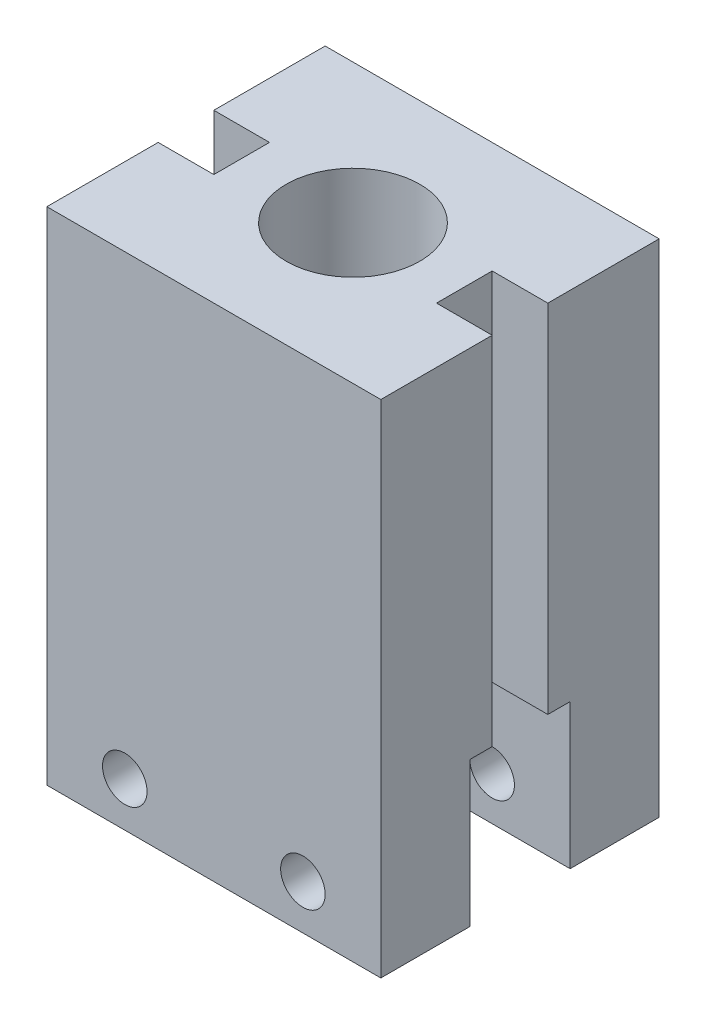
ISO-10303-21;
HEADER;
FILE_DESCRIPTION(('STEP AP214'),'2;1');
FILE_NAME('part.step','',(''),(''),'','','');
FILE_SCHEMA(('AUTOMOTIVE_DESIGN { 1 0 10303 214 1 1 1 1 }'));
ENDSEC;
DATA;
#1=APPLICATION_CONTEXT('core data for automotive mechanical design processes');
#2=APPLICATION_PROTOCOL_DEFINITION('international standard','automotive_design',2000,#1);
#3=PRODUCT_CONTEXT('',#1,'mechanical');
#4=PRODUCT('Part','Part','',(#3));
#5=PRODUCT_RELATED_PRODUCT_CATEGORY('part','',(#4));
#6=PRODUCT_DEFINITION_FORMATION('','',#4);
#7=PRODUCT_DEFINITION_CONTEXT('part definition',#1,'design');
#8=PRODUCT_DEFINITION('design','',#6,#7);
#9=PRODUCT_DEFINITION_SHAPE('','',#8);
#10=(LENGTH_UNIT() NAMED_UNIT(*) SI_UNIT(.MILLI.,.METRE.));
#11=(NAMED_UNIT(*) PLANE_ANGLE_UNIT() SI_UNIT($,.RADIAN.));
#12=(NAMED_UNIT(*) SI_UNIT($,.STERADIAN.) SOLID_ANGLE_UNIT());
#13=UNCERTAINTY_MEASURE_WITH_UNIT(LENGTH_MEASURE(1.E-05),#10,'distance_accuracy_value','');
#14=(GEOMETRIC_REPRESENTATION_CONTEXT(3) GLOBAL_UNCERTAINTY_ASSIGNED_CONTEXT((#13)) GLOBAL_UNIT_ASSIGNED_CONTEXT((#10,
#11,#12)) REPRESENTATION_CONTEXT('',''));
#15=CARTESIAN_POINT('',(0.,0.,0.));
#16=DIRECTION('',(0.,0.,1.));
#17=DIRECTION('',(1.,0.,0.));
#18=AXIS2_PLACEMENT_3D('',#15,#16,#17);
#19=CARTESIAN_POINT('',(15.,13.,-4.5));
#20=DIRECTION('',(0.,1.,0.));
#21=DIRECTION('',(0.,0.,1.));
#22=AXIS2_PLACEMENT_3D('',#19,#20,#21);
#23=PLANE('',#22);
#24=DIRECTION('',(-1.,0.,0.));
#25=VECTOR('',#24,1.);
#26=CARTESIAN_POINT('',(15.,13.,4.5));
#27=LINE('',#26,#25);
#28=CARTESIAN_POINT('',(15.,13.,4.5));
#29=VERTEX_POINT('',#28);
#30=CARTESIAN_POINT('',(3.96862696659688,13.,4.5));
#31=VERTEX_POINT('',#30);
#32=EDGE_CURVE('E193',#29,#31,#27,.T.);
#33=ORIENTED_EDGE('',*,*,#32,.T.);
#34=CARTESIAN_POINT('',(0.,13.,0.));
#35=DIRECTION('',(0.,1.,0.));
#36=DIRECTION('',(0.,0.,1.));
#37=AXIS2_PLACEMENT_3D('',#34,#35,#36);
#38=CIRCLE('',#37,6.);
#39=CARTESIAN_POINT('',(3.96862696659689,13.,-4.5));
#40=VERTEX_POINT('',#39);
#41=EDGE_CURVE('E172',#31,#40,#38,.T.);
#42=ORIENTED_EDGE('',*,*,#41,.T.);
#43=DIRECTION('',(-1.,0.,0.));
#44=VECTOR('',#43,1.);
#45=CARTESIAN_POINT('',(15.,13.,-4.5));
#46=LINE('',#45,#44);
#47=CARTESIAN_POINT('',(15.,13.,-4.5));
#48=VERTEX_POINT('',#47);
#49=EDGE_CURVE('E298',#48,#40,#46,.T.);
#50=ORIENTED_EDGE('',*,*,#49,.F.);
#51=DIRECTION('',(0.,0.,-1.));
#52=VECTOR('',#51,1.);
#53=CARTESIAN_POINT('',(15.,13.,-4.5));
#54=LINE('',#53,#52);
#55=CARTESIAN_POINT('',(15.,13.,-2.5));
#56=VERTEX_POINT('',#55);
#57=EDGE_CURVE('E59',#56,#48,#54,.T.);
#58=ORIENTED_EDGE('',*,*,#57,.F.);
#59=DIRECTION('',(1.,0.,0.));
#60=VECTOR('',#59,1.);
#61=CARTESIAN_POINT('',(15.,13.,-2.5));
#62=LINE('',#61,#60);
#63=CARTESIAN_POINT('',(10.,13.,-2.5));
#64=VERTEX_POINT('',#63);
#65=EDGE_CURVE('E295',#64,#56,#62,.T.);
#66=ORIENTED_EDGE('',*,*,#65,.F.);
#67=DIRECTION('',(0.,0.,-1.));
#68=VECTOR('',#67,1.);
#69=CARTESIAN_POINT('',(10.,13.,-2.5));
#70=LINE('',#69,#68);
#71=CARTESIAN_POINT('',(10.,13.,2.5));
#72=VERTEX_POINT('',#71);
#73=EDGE_CURVE('E204',#72,#64,#70,.T.);
#74=ORIENTED_EDGE('',*,*,#73,.F.);
#75=DIRECTION('',(-1.,0.,0.));
#76=VECTOR('',#75,1.);
#77=CARTESIAN_POINT('',(15.,13.,2.5));
#78=LINE('',#77,#76);
#79=CARTESIAN_POINT('',(15.,13.,2.5));
#80=VERTEX_POINT('',#79);
#81=EDGE_CURVE('E208',#80,#72,#78,.T.);
#82=ORIENTED_EDGE('',*,*,#81,.F.);
#83=EDGE_CURVE('E341',#29,#80,#54,.T.);
#84=ORIENTED_EDGE('',*,*,#83,.F.);
#85=EDGE_LOOP('',(#33,#42,#50,#58,#66,#74,#82,#84));
#86=FACE_BOUND('',#85,.T.);
#87=ADVANCED_FACE('F36',(#86),#23,.F.);
#88=CARTESIAN_POINT('',(15.,0.,-4.5));
#89=DIRECTION('',(0.,0.,-1.));
#90=DIRECTION('',(-1.,0.,0.));
#91=AXIS2_PLACEMENT_3D('',#88,#89,#90);
#92=PLANE('',#91);
#93=CARTESIAN_POINT('',(-8.,4.,-4.5));
#94=DIRECTION('',(0.,0.,-1.));
#95=DIRECTION('',(-1.,0.,0.));
#96=AXIS2_PLACEMENT_3D('',#93,#94,#95);
#97=CIRCLE('',#96,2.);
#98=CARTESIAN_POINT('',(-10.,4.,-4.5));
#99=VERTEX_POINT('',#98);
#100=EDGE_CURVE('E205',#99,#99,#97,.F.);
#101=ORIENTED_EDGE('',*,*,#100,.F.);
#102=EDGE_LOOP('',(#101));
#103=FACE_BOUND('',#102,.T.);
#104=DIRECTION('',(-1.,0.,0.));
#105=VECTOR('',#104,1.);
#106=CARTESIAN_POINT('',(15.,0.,-4.5));
#107=LINE('',#106,#105);
#108=CARTESIAN_POINT('',(-3.96862696659689,0.,-4.5));
#109=VERTEX_POINT('',#108);
#110=CARTESIAN_POINT('',(-15.,0.,-4.5));
#111=VERTEX_POINT('',#110);
#112=EDGE_CURVE('E200',#109,#111,#107,.T.);
#113=ORIENTED_EDGE('',*,*,#112,.F.);
#114=DIRECTION('',(0.,1.,0.));
#115=VECTOR('',#114,1.);
#116=CARTESIAN_POINT('',(-3.96862696659689,0.,-4.5));
#117=LINE('',#116,#115);
#118=CARTESIAN_POINT('',(-3.96862696659689,13.,-4.5));
#119=VERTEX_POINT('',#118);
#120=EDGE_CURVE('E320',#109,#119,#117,.T.);
#121=ORIENTED_EDGE('',*,*,#120,.T.);
#122=CARTESIAN_POINT('',(-15.,13.,-4.5));
#123=VERTEX_POINT('',#122);
#124=EDGE_CURVE('E319',#119,#123,#46,.T.);
#125=ORIENTED_EDGE('',*,*,#124,.T.);
#126=DIRECTION('',(0.,-1.,0.));
#127=VECTOR('',#126,1.);
#128=CARTESIAN_POINT('',(-15.,0.,-4.5));
#129=LINE('',#128,#127);
#130=EDGE_CURVE('E306',#123,#111,#129,.T.);
#131=ORIENTED_EDGE('',*,*,#130,.T.);
#132=EDGE_LOOP('',(#113,#121,#125,#131));
#133=FACE_BOUND('',#132,.T.);
#134=ADVANCED_FACE('F386',(#103,#133),#92,.F.);
#135=CARTESIAN_POINT('',(15.,0.,4.5));
#136=DIRECTION('',(0.,0.,1.));
#137=DIRECTION('',(0.,-1.,0.));
#138=AXIS2_PLACEMENT_3D('',#135,#136,#137);
#139=PLANE('',#138);
#140=CARTESIAN_POINT('',(8.,4.,4.5));
#141=DIRECTION('',(0.,0.,1.));
#142=DIRECTION('',(0.,-1.,0.));
#143=AXIS2_PLACEMENT_3D('',#140,#141,#142);
#144=CIRCLE('',#143,2.);
#145=CARTESIAN_POINT('',(8.,2.,4.5));
#146=VERTEX_POINT('',#145);
#147=EDGE_CURVE('E303',#146,#146,#144,.T.);
#148=ORIENTED_EDGE('',*,*,#147,.T.);
#149=EDGE_LOOP('',(#148));
#150=FACE_BOUND('',#149,.T.);
#151=DIRECTION('',(-1.,0.,0.));
#152=VECTOR('',#151,1.);
#153=CARTESIAN_POINT('',(15.,0.,4.5));
#154=LINE('',#153,#152);
#155=CARTESIAN_POINT('',(15.,0.,4.5));
#156=VERTEX_POINT('',#155);
#157=CARTESIAN_POINT('',(3.96862696659688,0.,4.5));
#158=VERTEX_POINT('',#157);
#159=EDGE_CURVE('E181',#156,#158,#154,.T.);
#160=ORIENTED_EDGE('',*,*,#159,.T.);
#161=DIRECTION('',(0.,1.,0.));
#162=VECTOR('',#161,1.);
#163=CARTESIAN_POINT('',(3.96862696659688,0.,4.5));
#164=LINE('',#163,#162);
#165=EDGE_CURVE('E11',#158,#31,#164,.T.);
#166=ORIENTED_EDGE('',*,*,#165,.T.);
#167=ORIENTED_EDGE('',*,*,#32,.F.);
#168=DIRECTION('',(0.,1.,0.));
#169=VECTOR('',#168,1.);
#170=CARTESIAN_POINT('',(15.,0.,4.5));
#171=LINE('',#170,#169);
#172=EDGE_CURVE('E190',#156,#29,#171,.T.);
#173=ORIENTED_EDGE('',*,*,#172,.F.);
#174=EDGE_LOOP('',(#160,#166,#167,#173));
#175=FACE_BOUND('',#174,.T.);
#176=ADVANCED_FACE('F188',(#150,#175),#139,.F.);
#177=CARTESIAN_POINT('',(0.,0.,0.));
#178=DIRECTION('',(0.,1.,0.));
#179=DIRECTION('',(0.,0.,1.));
#180=AXIS2_PLACEMENT_3D('',#177,#178,#179);
#181=PLANE('',#180);
#182=CARTESIAN_POINT('',(15.,0.,-4.5));
#183=VERTEX_POINT('',#182);
#184=CARTESIAN_POINT('',(3.96862696659689,0.,-4.5));
#185=VERTEX_POINT('',#184);
#186=EDGE_CURVE('E195',#183,#185,#107,.T.);
#187=ORIENTED_EDGE('',*,*,#186,.T.);
#188=CARTESIAN_POINT('',(0.,0.,0.));
#189=DIRECTION('',(0.,1.,0.));
#190=DIRECTION('',(0.,0.,1.));
#191=AXIS2_PLACEMENT_3D('',#188,#189,#190);
#192=CIRCLE('',#191,6.);
#193=EDGE_CURVE('E185',#185,#109,#192,.T.);
#194=ORIENTED_EDGE('',*,*,#193,.T.);
#195=ORIENTED_EDGE('',*,*,#112,.T.);
#196=DIRECTION('',(0.,0.,1.));
#197=VECTOR('',#196,1.);
#198=CARTESIAN_POINT('',(-15.,0.,-12.5));
#199=LINE('',#198,#197);
#200=CARTESIAN_POINT('',(-15.,0.,-12.5));
#201=VERTEX_POINT('',#200);
#202=EDGE_CURVE('E279',#201,#111,#199,.T.);
#203=ORIENTED_EDGE('',*,*,#202,.F.);
#204=DIRECTION('',(-1.,0.,0.));
#205=VECTOR('',#204,1.);
#206=CARTESIAN_POINT('',(-15.,0.,-12.5));
#207=LINE('',#206,#205);
#208=CARTESIAN_POINT('',(15.,0.,-12.5));
#209=VERTEX_POINT('',#208);
#210=EDGE_CURVE('E276',#209,#201,#207,.T.);
#211=ORIENTED_EDGE('',*,*,#210,.F.);
#212=DIRECTION('',(0.,0.,-1.));
#213=VECTOR('',#212,1.);
#214=CARTESIAN_POINT('',(15.,0.,-12.5));
#215=LINE('',#214,#213);
#216=EDGE_CURVE('E240',#183,#209,#215,.T.);
#217=ORIENTED_EDGE('',*,*,#216,.F.);
#218=EDGE_LOOP('',(#187,#194,#195,#203,#211,#217));
#219=FACE_BOUND('',#218,.T.);
#220=ADVANCED_FACE('F388',(#219),#181,.F.);
#221=CARTESIAN_POINT('',(15.,45.,-12.5));
#222=DIRECTION('',(-1.,0.,0.));
#223=DIRECTION('',(0.,0.,1.));
#224=AXIS2_PLACEMENT_3D('',#221,#222,#223);
#225=PLANE('',#224);
#226=ORIENTED_EDGE('',*,*,#172,.T.);
#227=ORIENTED_EDGE('',*,*,#83,.T.);
#228=DIRECTION('',(0.,1.,0.));
#229=VECTOR('',#228,1.);
#230=CARTESIAN_POINT('',(15.,0.,2.5));
#231=LINE('',#230,#229);
#232=CARTESIAN_POINT('',(15.,45.,2.5));
#233=VERTEX_POINT('',#232);
#234=EDGE_CURVE('E238',#80,#233,#231,.T.);
#235=ORIENTED_EDGE('',*,*,#234,.T.);
#236=DIRECTION('',(0.,0.,-1.));
#237=VECTOR('',#236,1.);
#238=CARTESIAN_POINT('',(15.,45.,-12.5));
#239=LINE('',#238,#237);
#240=CARTESIAN_POINT('',(15.,45.,12.5));
#241=VERTEX_POINT('',#240);
#242=EDGE_CURVE('E261',#241,#233,#239,.T.);
#243=ORIENTED_EDGE('',*,*,#242,.F.);
#244=DIRECTION('',(0.,-1.,0.));
#245=VECTOR('',#244,1.);
#246=CARTESIAN_POINT('',(15.,45.,12.5));
#247=LINE('',#246,#245);
#248=CARTESIAN_POINT('',(15.,0.,12.5));
#249=VERTEX_POINT('',#248);
#250=EDGE_CURVE('E273',#241,#249,#247,.T.);
#251=ORIENTED_EDGE('',*,*,#250,.T.);
#252=EDGE_CURVE('E274',#249,#156,#215,.T.);
#253=ORIENTED_EDGE('',*,*,#252,.T.);
#254=EDGE_LOOP('',(#226,#227,#235,#243,#251,#253));
#255=FACE_BOUND('',#254,.T.);
#256=ADVANCED_FACE('F354',(#255),#225,.F.);
#257=CARTESIAN_POINT('',(-15.,45.,-12.5));
#258=DIRECTION('',(1.,0.,0.));
#259=DIRECTION('',(0.,0.,-1.));
#260=AXIS2_PLACEMENT_3D('',#257,#258,#259);
#261=PLANE('',#260);
#262=ORIENTED_EDGE('',*,*,#202,.T.);
#263=ORIENTED_EDGE('',*,*,#130,.F.);
#264=DIRECTION('',(0.,0.,-1.));
#265=VECTOR('',#264,1.);
#266=CARTESIAN_POINT('',(-15.,13.,-4.5));
#267=LINE('',#266,#265);
#268=CARTESIAN_POINT('',(-15.,13.,-2.5));
#269=VERTEX_POINT('',#268);
#270=EDGE_CURVE('E348',#269,#123,#267,.T.);
#271=ORIENTED_EDGE('',*,*,#270,.F.);
#272=DIRECTION('',(0.,1.,0.));
#273=VECTOR('',#272,1.);
#274=CARTESIAN_POINT('',(-15.,0.,-2.5));
#275=LINE('',#274,#273);
#276=CARTESIAN_POINT('',(-15.,45.,-2.5));
#277=VERTEX_POINT('',#276);
#278=EDGE_CURVE('E231',#269,#277,#275,.T.);
#279=ORIENTED_EDGE('',*,*,#278,.T.);
#280=DIRECTION('',(0.,0.,1.));
#281=VECTOR('',#280,1.);
#282=CARTESIAN_POINT('',(-15.,45.,-12.5));
#283=LINE('',#282,#281);
#284=CARTESIAN_POINT('',(-15.,45.,-12.5));
#285=VERTEX_POINT('',#284);
#286=EDGE_CURVE('E268',#285,#277,#283,.T.);
#287=ORIENTED_EDGE('',*,*,#286,.F.);
#288=DIRECTION('',(0.,-1.,0.));
#289=VECTOR('',#288,1.);
#290=CARTESIAN_POINT('',(-15.,45.,-12.5));
#291=LINE('',#290,#289);
#292=EDGE_CURVE('E289',#285,#201,#291,.T.);
#293=ORIENTED_EDGE('',*,*,#292,.T.);
#294=EDGE_LOOP('',(#262,#263,#271,#279,#287,#293));
#295=FACE_BOUND('',#294,.T.);
#296=ADVANCED_FACE('F382',(#295),#261,.F.);
#297=ORIENTED_EDGE('',*,*,#57,.T.);
#298=DIRECTION('',(0.,-1.,0.));
#299=VECTOR('',#298,1.);
#300=CARTESIAN_POINT('',(15.,0.,-4.5));
#301=LINE('',#300,#299);
#302=EDGE_CURVE('E336',#48,#183,#301,.T.);
#303=ORIENTED_EDGE('',*,*,#302,.T.);
#304=ORIENTED_EDGE('',*,*,#216,.T.);
#305=DIRECTION('',(0.,-1.,0.));
#306=VECTOR('',#305,1.);
#307=CARTESIAN_POINT('',(15.,45.,-12.5));
#308=LINE('',#307,#306);
#309=CARTESIAN_POINT('',(15.,45.,-12.5));
#310=VERTEX_POINT('',#309);
#311=EDGE_CURVE('E292',#310,#209,#308,.T.);
#312=ORIENTED_EDGE('',*,*,#311,.F.);
#313=CARTESIAN_POINT('',(15.,45.,-2.5));
#314=VERTEX_POINT('',#313);
#315=EDGE_CURVE('E265',#314,#310,#239,.T.);
#316=ORIENTED_EDGE('',*,*,#315,.F.);
#317=DIRECTION('',(0.,1.,0.));
#318=VECTOR('',#317,1.);
#319=CARTESIAN_POINT('',(15.,0.,-2.5));
#320=LINE('',#319,#318);
#321=EDGE_CURVE('E237',#56,#314,#320,.T.);
#322=ORIENTED_EDGE('',*,*,#321,.F.);
#323=EDGE_LOOP('',(#297,#303,#304,#312,#316,#322));
#324=FACE_BOUND('',#323,.T.);
#325=ADVANCED_FACE('F38',(#324),#225,.F.);
#326=CARTESIAN_POINT('',(-15.,45.,-12.5));
#327=DIRECTION('',(0.,0.,1.));
#328=DIRECTION('',(1.,0.,0.));
#329=AXIS2_PLACEMENT_3D('',#326,#327,#328);
#330=PLANE('',#329);
#331=CARTESIAN_POINT('',(-8.,4.,-12.5));
#332=DIRECTION('',(0.,0.,-1.));
#333=DIRECTION('',(-1.,0.,0.));
#334=AXIS2_PLACEMENT_3D('',#331,#332,#333);
#335=CIRCLE('',#334,2.);
#336=CARTESIAN_POINT('',(-10.,4.,-12.5));
#337=VERTEX_POINT('',#336);
#338=EDGE_CURVE('E221',#337,#337,#335,.T.);
#339=ORIENTED_EDGE('',*,*,#338,.F.);
#340=EDGE_LOOP('',(#339));
#341=FACE_BOUND('',#340,.T.);
#342=CARTESIAN_POINT('',(8.,4.,-12.5));
#343=DIRECTION('',(0.,0.,-1.));
#344=DIRECTION('',(-1.,0.,0.));
#345=AXIS2_PLACEMENT_3D('',#342,#343,#344);
#346=CIRCLE('',#345,2.);
#347=CARTESIAN_POINT('',(6.,4.,-12.5));
#348=VERTEX_POINT('',#347);
#349=EDGE_CURVE('E220',#348,#348,#346,.T.);
#350=ORIENTED_EDGE('',*,*,#349,.F.);
#351=EDGE_LOOP('',(#350));
#352=FACE_BOUND('',#351,.T.);
#353=ORIENTED_EDGE('',*,*,#210,.T.);
#354=ORIENTED_EDGE('',*,*,#292,.F.);
#355=DIRECTION('',(-1.,0.,0.));
#356=VECTOR('',#355,1.);
#357=CARTESIAN_POINT('',(-15.,45.,-12.5));
#358=LINE('',#357,#356);
#359=EDGE_CURVE('E264',#310,#285,#358,.T.);
#360=ORIENTED_EDGE('',*,*,#359,.F.);
#361=ORIENTED_EDGE('',*,*,#311,.T.);
#362=EDGE_LOOP('',(#353,#354,#360,#361));
#363=FACE_BOUND('',#362,.T.);
#364=ADVANCED_FACE('F413',(#341,#352,#363),#330,.F.);
#365=DIRECTION('',(0.,1.,0.));
#366=VECTOR('',#365,1.);
#367=CARTESIAN_POINT('',(-15.,0.,2.5));
#368=LINE('',#367,#366);
#369=CARTESIAN_POINT('',(-15.,13.,2.5));
#370=VERTEX_POINT('',#369);
#371=CARTESIAN_POINT('',(-15.,45.,2.5));
#372=VERTEX_POINT('',#371);
#373=EDGE_CURVE('E254',#370,#372,#368,.T.);
#374=ORIENTED_EDGE('',*,*,#373,.F.);
#375=CARTESIAN_POINT('',(-15.,13.,4.5));
#376=VERTEX_POINT('',#375);
#377=EDGE_CURVE('E339',#376,#370,#267,.T.);
#378=ORIENTED_EDGE('',*,*,#377,.F.);
#379=DIRECTION('',(0.,1.,0.));
#380=VECTOR('',#379,1.);
#381=CARTESIAN_POINT('',(-15.,0.,4.5));
#382=LINE('',#381,#380);
#383=CARTESIAN_POINT('',(-15.,0.,4.5));
#384=VERTEX_POINT('',#383);
#385=EDGE_CURVE('E346',#384,#376,#382,.T.);
#386=ORIENTED_EDGE('',*,*,#385,.F.);
#387=CARTESIAN_POINT('',(-15.,0.,12.5));
#388=VERTEX_POINT('',#387);
#389=EDGE_CURVE('E278',#384,#388,#199,.T.);
#390=ORIENTED_EDGE('',*,*,#389,.T.);
#391=DIRECTION('',(0.,-1.,0.));
#392=VECTOR('',#391,1.);
#393=CARTESIAN_POINT('',(-15.,45.,12.5));
#394=LINE('',#393,#392);
#395=CARTESIAN_POINT('',(-15.,45.,12.5));
#396=VERTEX_POINT('',#395);
#397=EDGE_CURVE('E286',#396,#388,#394,.T.);
#398=ORIENTED_EDGE('',*,*,#397,.F.);
#399=EDGE_CURVE('E267',#372,#396,#283,.T.);
#400=ORIENTED_EDGE('',*,*,#399,.F.);
#401=EDGE_LOOP('',(#374,#378,#386,#390,#398,#400));
#402=FACE_BOUND('',#401,.T.);
#403=ADVANCED_FACE('F365',(#402),#261,.F.);
#404=CARTESIAN_POINT('',(-15.,45.,12.5));
#405=DIRECTION('',(0.,0.,-1.));
#406=DIRECTION('',(-1.,0.,0.));
#407=AXIS2_PLACEMENT_3D('',#404,#405,#406);
#408=PLANE('',#407);
#409=CARTESIAN_POINT('',(8.,4.,12.5));
#410=DIRECTION('',(0.,0.,1.));
#411=DIRECTION('',(1.,0.,0.));
#412=AXIS2_PLACEMENT_3D('',#409,#410,#411);
#413=CIRCLE('',#412,2.);
#414=CARTESIAN_POINT('',(10.,4.,12.5));
#415=VERTEX_POINT('',#414);
#416=EDGE_CURVE('E304',#415,#415,#413,.T.);
#417=ORIENTED_EDGE('',*,*,#416,.F.);
#418=EDGE_LOOP('',(#417));
#419=FACE_BOUND('',#418,.T.);
#420=CARTESIAN_POINT('',(-8.,4.,12.5));
#421=DIRECTION('',(0.,0.,1.));
#422=DIRECTION('',(1.,0.,0.));
#423=AXIS2_PLACEMENT_3D('',#420,#421,#422);
#424=CIRCLE('',#423,2.);
#425=CARTESIAN_POINT('',(-6.,4.,12.5));
#426=VERTEX_POINT('',#425);
#427=EDGE_CURVE('E328',#426,#426,#424,.T.);
#428=ORIENTED_EDGE('',*,*,#427,.F.);
#429=EDGE_LOOP('',(#428));
#430=FACE_BOUND('',#429,.T.);
#431=DIRECTION('',(1.,0.,0.));
#432=VECTOR('',#431,1.);
#433=CARTESIAN_POINT('',(-15.,0.,12.5));
#434=LINE('',#433,#432);
#435=EDGE_CURVE('E282',#388,#249,#434,.T.);
#436=ORIENTED_EDGE('',*,*,#435,.T.);
#437=ORIENTED_EDGE('',*,*,#250,.F.);
#438=DIRECTION('',(1.,0.,0.));
#439=VECTOR('',#438,1.);
#440=CARTESIAN_POINT('',(-15.,45.,12.5));
#441=LINE('',#440,#439);
#442=EDGE_CURVE('E271',#396,#241,#441,.T.);
#443=ORIENTED_EDGE('',*,*,#442,.F.);
#444=ORIENTED_EDGE('',*,*,#397,.T.);
#445=EDGE_LOOP('',(#436,#437,#443,#444));
#446=FACE_BOUND('',#445,.T.);
#447=ADVANCED_FACE('F359',(#419,#430,#446),#408,.F.);
#448=CARTESIAN_POINT('',(0.,45.,0.));
#449=DIRECTION('',(0.,1.,0.));
#450=DIRECTION('',(0.,0.,1.));
#451=AXIS2_PLACEMENT_3D('',#448,#449,#450);
#452=PLANE('',#451);
#453=CARTESIAN_POINT('',(0.,45.,0.));
#454=DIRECTION('',(0.,1.,0.));
#455=DIRECTION('',(0.,0.,1.));
#456=AXIS2_PLACEMENT_3D('',#453,#454,#455);
#457=CIRCLE('',#456,6.);
#458=CARTESIAN_POINT('',(0.,45.,6.));
#459=VERTEX_POINT('',#458);
#460=EDGE_CURVE('E186',#459,#459,#457,.T.);
#461=ORIENTED_EDGE('',*,*,#460,.F.);
#462=EDGE_LOOP('',(#461));
#463=FACE_BOUND('',#462,.T.);
#464=DIRECTION('',(1.,0.,0.));
#465=VECTOR('',#464,1.);
#466=CARTESIAN_POINT('',(15.,45.,2.5));
#467=LINE('',#466,#465);
#468=CARTESIAN_POINT('',(10.,45.,2.5));
#469=VERTEX_POINT('',#468);
#470=EDGE_CURVE('E234',#469,#233,#467,.T.);
#471=ORIENTED_EDGE('',*,*,#470,.F.);
#472=DIRECTION('',(0.,0.,1.));
#473=VECTOR('',#472,1.);
#474=CARTESIAN_POINT('',(10.,45.,-2.5));
#475=LINE('',#474,#473);
#476=CARTESIAN_POINT('',(10.,45.,-2.5));
#477=VERTEX_POINT('',#476);
#478=EDGE_CURVE('E230',#477,#469,#475,.T.);
#479=ORIENTED_EDGE('',*,*,#478,.F.);
#480=DIRECTION('',(-1.,0.,0.));
#481=VECTOR('',#480,1.);
#482=CARTESIAN_POINT('',(15.,45.,-2.5));
#483=LINE('',#482,#481);
#484=EDGE_CURVE('E227',#314,#477,#483,.T.);
#485=ORIENTED_EDGE('',*,*,#484,.F.);
#486=ORIENTED_EDGE('',*,*,#315,.T.);
#487=ORIENTED_EDGE('',*,*,#359,.T.);
#488=ORIENTED_EDGE('',*,*,#286,.T.);
#489=DIRECTION('',(-1.,0.,0.));
#490=VECTOR('',#489,1.);
#491=CARTESIAN_POINT('',(-15.,45.,-2.5));
#492=LINE('',#491,#490);
#493=CARTESIAN_POINT('',(-10.,45.,-2.5));
#494=VERTEX_POINT('',#493);
#495=EDGE_CURVE('E251',#494,#277,#492,.T.);
#496=ORIENTED_EDGE('',*,*,#495,.F.);
#497=DIRECTION('',(0.,0.,-1.));
#498=VECTOR('',#497,1.);
#499=CARTESIAN_POINT('',(-10.,45.,-2.5));
#500=LINE('',#499,#498);
#501=CARTESIAN_POINT('',(-10.,45.,2.5));
#502=VERTEX_POINT('',#501);
#503=EDGE_CURVE('E248',#502,#494,#500,.T.);
#504=ORIENTED_EDGE('',*,*,#503,.F.);
#505=DIRECTION('',(1.,0.,0.));
#506=VECTOR('',#505,1.);
#507=CARTESIAN_POINT('',(-15.,45.,2.5));
#508=LINE('',#507,#506);
#509=EDGE_CURVE('E224',#372,#502,#508,.T.);
#510=ORIENTED_EDGE('',*,*,#509,.F.);
#511=ORIENTED_EDGE('',*,*,#399,.T.);
#512=ORIENTED_EDGE('',*,*,#442,.T.);
#513=ORIENTED_EDGE('',*,*,#242,.T.);
#514=EDGE_LOOP('',(#471,#479,#485,#486,#487,#488,#496,#504,#510,#511,#512,#513));
#515=FACE_BOUND('',#514,.T.);
#516=ADVANCED_FACE('F404',(#463,#515),#452,.T.);
#517=CARTESIAN_POINT('',(-3.96862696659688,0.,4.5));
#518=VERTEX_POINT('',#517);
#519=EDGE_CURVE('E184',#518,#384,#154,.T.);
#520=ORIENTED_EDGE('',*,*,#519,.F.);
#521=EDGE_CURVE('E51',#518,#158,#192,.T.);
#522=ORIENTED_EDGE('',*,*,#521,.T.);
#523=ORIENTED_EDGE('',*,*,#159,.F.);
#524=ORIENTED_EDGE('',*,*,#252,.F.);
#525=ORIENTED_EDGE('',*,*,#435,.F.);
#526=ORIENTED_EDGE('',*,*,#389,.F.);
#527=EDGE_LOOP('',(#520,#522,#523,#524,#525,#526));
#528=FACE_BOUND('',#527,.T.);
#529=ADVANCED_FACE('F179',(#528),#181,.F.);
#530=CARTESIAN_POINT('',(-15.,0.,-2.5));
#531=DIRECTION('',(0.,0.,-1.));
#532=DIRECTION('',(-1.,0.,0.));
#533=AXIS2_PLACEMENT_3D('',#530,#531,#532);
#534=PLANE('',#533);
#535=ORIENTED_EDGE('',*,*,#278,.F.);
#536=DIRECTION('',(1.,0.,0.));
#537=VECTOR('',#536,1.);
#538=CARTESIAN_POINT('',(-15.,13.,-2.5));
#539=LINE('',#538,#537);
#540=CARTESIAN_POINT('',(-10.,13.,-2.5));
#541=VERTEX_POINT('',#540);
#542=EDGE_CURVE('E217',#269,#541,#539,.T.);
#543=ORIENTED_EDGE('',*,*,#542,.T.);
#544=DIRECTION('',(0.,1.,0.));
#545=VECTOR('',#544,1.);
#546=CARTESIAN_POINT('',(-10.,0.,-2.5));
#547=LINE('',#546,#545);
#548=EDGE_CURVE('E256',#541,#494,#547,.T.);
#549=ORIENTED_EDGE('',*,*,#548,.T.);
#550=ORIENTED_EDGE('',*,*,#495,.T.);
#551=EDGE_LOOP('',(#535,#543,#549,#550));
#552=FACE_BOUND('',#551,.T.);
#553=ADVANCED_FACE('F379',(#552),#534,.F.);
#554=CARTESIAN_POINT('',(-10.,0.,-2.5));
#555=DIRECTION('',(1.,0.,0.));
#556=DIRECTION('',(0.,0.,-1.));
#557=AXIS2_PLACEMENT_3D('',#554,#555,#556);
#558=PLANE('',#557);
#559=ORIENTED_EDGE('',*,*,#548,.F.);
#560=DIRECTION('',(0.,0.,1.));
#561=VECTOR('',#560,1.);
#562=CARTESIAN_POINT('',(-10.,13.,-2.5));
#563=LINE('',#562,#561);
#564=CARTESIAN_POINT('',(-10.,13.,2.5));
#565=VERTEX_POINT('',#564);
#566=EDGE_CURVE('E214',#541,#565,#563,.T.);
#567=ORIENTED_EDGE('',*,*,#566,.T.);
#568=DIRECTION('',(0.,1.,0.));
#569=VECTOR('',#568,1.);
#570=CARTESIAN_POINT('',(-10.,0.,2.5));
#571=LINE('',#570,#569);
#572=EDGE_CURVE('E258',#565,#502,#571,.T.);
#573=ORIENTED_EDGE('',*,*,#572,.T.);
#574=ORIENTED_EDGE('',*,*,#503,.T.);
#575=EDGE_LOOP('',(#559,#567,#573,#574));
#576=FACE_BOUND('',#575,.T.);
#577=ADVANCED_FACE('F374',(#576),#558,.F.);
#578=CARTESIAN_POINT('',(-15.,0.,2.5));
#579=DIRECTION('',(0.,0.,1.));
#580=DIRECTION('',(1.,0.,0.));
#581=AXIS2_PLACEMENT_3D('',#578,#579,#580);
#582=PLANE('',#581);
#583=ORIENTED_EDGE('',*,*,#572,.F.);
#584=DIRECTION('',(-1.,0.,0.));
#585=VECTOR('',#584,1.);
#586=CARTESIAN_POINT('',(-15.,13.,2.5));
#587=LINE('',#586,#585);
#588=EDGE_CURVE('E211',#565,#370,#587,.T.);
#589=ORIENTED_EDGE('',*,*,#588,.T.);
#590=ORIENTED_EDGE('',*,*,#373,.T.);
#591=ORIENTED_EDGE('',*,*,#509,.T.);
#592=EDGE_LOOP('',(#583,#589,#590,#591));
#593=FACE_BOUND('',#592,.T.);
#594=ADVANCED_FACE('F369',(#593),#582,.F.);
#595=CARTESIAN_POINT('',(15.,0.,2.5));
#596=DIRECTION('',(0.,0.,1.));
#597=DIRECTION('',(1.,0.,0.));
#598=AXIS2_PLACEMENT_3D('',#595,#596,#597);
#599=PLANE('',#598);
#600=ORIENTED_EDGE('',*,*,#234,.F.);
#601=ORIENTED_EDGE('',*,*,#81,.T.);
#602=DIRECTION('',(0.,1.,0.));
#603=VECTOR('',#602,1.);
#604=CARTESIAN_POINT('',(10.,0.,2.5));
#605=LINE('',#604,#603);
#606=EDGE_CURVE('E241',#72,#469,#605,.T.);
#607=ORIENTED_EDGE('',*,*,#606,.T.);
#608=ORIENTED_EDGE('',*,*,#470,.T.);
#609=EDGE_LOOP('',(#600,#601,#607,#608));
#610=FACE_BOUND('',#609,.T.);
#611=ADVANCED_FACE('F410',(#610),#599,.F.);
#612=CARTESIAN_POINT('',(10.,0.,-2.5));
#613=DIRECTION('',(-1.,0.,0.));
#614=DIRECTION('',(0.,0.,1.));
#615=AXIS2_PLACEMENT_3D('',#612,#613,#614);
#616=PLANE('',#615);
#617=ORIENTED_EDGE('',*,*,#606,.F.);
#618=ORIENTED_EDGE('',*,*,#73,.T.);
#619=DIRECTION('',(0.,1.,0.));
#620=VECTOR('',#619,1.);
#621=CARTESIAN_POINT('',(10.,0.,-2.5));
#622=LINE('',#621,#620);
#623=EDGE_CURVE('E243',#64,#477,#622,.T.);
#624=ORIENTED_EDGE('',*,*,#623,.T.);
#625=ORIENTED_EDGE('',*,*,#478,.T.);
#626=EDGE_LOOP('',(#617,#618,#624,#625));
#627=FACE_BOUND('',#626,.T.);
#628=ADVANCED_FACE('F408',(#627),#616,.F.);
#629=CARTESIAN_POINT('',(15.,0.,-2.5));
#630=DIRECTION('',(0.,0.,-1.));
#631=DIRECTION('',(-1.,0.,0.));
#632=AXIS2_PLACEMENT_3D('',#629,#630,#631);
#633=PLANE('',#632);
#634=ORIENTED_EDGE('',*,*,#623,.F.);
#635=ORIENTED_EDGE('',*,*,#65,.T.);
#636=ORIENTED_EDGE('',*,*,#321,.T.);
#637=ORIENTED_EDGE('',*,*,#484,.T.);
#638=EDGE_LOOP('',(#634,#635,#636,#637));
#639=FACE_BOUND('',#638,.T.);
#640=ADVANCED_FACE('F400',(#639),#633,.F.);
#641=CARTESIAN_POINT('',(8.,4.,-3.5));
#642=DIRECTION('',(0.,0.,-1.));
#643=DIRECTION('',(-1.,0.,0.));
#644=AXIS2_PLACEMENT_3D('',#641,#642,#643);
#645=CYLINDRICAL_SURFACE('',#644,2.);
#646=CARTESIAN_POINT('',(8.,4.,-4.5));
#647=DIRECTION('',(0.,0.,-1.));
#648=DIRECTION('',(-1.,0.,0.));
#649=AXIS2_PLACEMENT_3D('',#646,#647,#648);
#650=CIRCLE('',#649,2.);
#651=CARTESIAN_POINT('',(6.,4.,-4.5));
#652=VERTEX_POINT('',#651);
#653=EDGE_CURVE('E201',#652,#652,#650,.F.);
#654=ORIENTED_EDGE('',*,*,#653,.T.);
#655=EDGE_LOOP('',(#654));
#656=FACE_BOUND('',#655,.T.);
#657=ORIENTED_EDGE('',*,*,#349,.T.);
#658=EDGE_LOOP('',(#657));
#659=FACE_BOUND('',#658,.T.);
#660=ADVANCED_FACE('F438',(#656,#659),#645,.F.);
#661=CARTESIAN_POINT('',(-8.,4.,-3.5));
#662=DIRECTION('',(0.,0.,-1.));
#663=DIRECTION('',(-1.,0.,0.));
#664=AXIS2_PLACEMENT_3D('',#661,#662,#663);
#665=CYLINDRICAL_SURFACE('',#664,2.);
#666=ORIENTED_EDGE('',*,*,#100,.T.);
#667=EDGE_LOOP('',(#666));
#668=FACE_BOUND('',#667,.T.);
#669=ORIENTED_EDGE('',*,*,#338,.T.);
#670=EDGE_LOOP('',(#669));
#671=FACE_BOUND('',#670,.T.);
#672=ADVANCED_FACE('F433',(#668,#671),#665,.F.);
#673=ORIENTED_EDGE('',*,*,#124,.F.);
#674=CARTESIAN_POINT('',(-3.96862696659688,13.,4.5));
#675=VERTEX_POINT('',#674);
#676=EDGE_CURVE('E313',#119,#675,#38,.T.);
#677=ORIENTED_EDGE('',*,*,#676,.T.);
#678=EDGE_CURVE('E191',#675,#376,#27,.T.);
#679=ORIENTED_EDGE('',*,*,#678,.T.);
#680=ORIENTED_EDGE('',*,*,#377,.T.);
#681=ORIENTED_EDGE('',*,*,#588,.F.);
#682=ORIENTED_EDGE('',*,*,#566,.F.);
#683=ORIENTED_EDGE('',*,*,#542,.F.);
#684=ORIENTED_EDGE('',*,*,#270,.T.);
#685=EDGE_LOOP('',(#673,#677,#679,#680,#681,#682,#683,#684));
#686=FACE_BOUND('',#685,.T.);
#687=ADVANCED_FACE('F317',(#686),#23,.F.);
#688=ORIENTED_EDGE('',*,*,#49,.T.);
#689=DIRECTION('',(0.,1.,0.));
#690=VECTOR('',#689,1.);
#691=CARTESIAN_POINT('',(3.96862696659689,0.,-4.5));
#692=LINE('',#691,#690);
#693=EDGE_CURVE('E325',#40,#185,#692,.F.);
#694=ORIENTED_EDGE('',*,*,#693,.T.);
#695=ORIENTED_EDGE('',*,*,#186,.F.);
#696=ORIENTED_EDGE('',*,*,#302,.F.);
#697=EDGE_LOOP('',(#688,#694,#695,#696));
#698=FACE_BOUND('',#697,.T.);
#699=ORIENTED_EDGE('',*,*,#653,.F.);
#700=EDGE_LOOP('',(#699));
#701=FACE_BOUND('',#700,.T.);
#702=ADVANCED_FACE('F391',(#698,#701),#92,.F.);
#703=CARTESIAN_POINT('',(-8.,4.,4.5));
#704=DIRECTION('',(0.,0.,1.));
#705=DIRECTION('',(0.,-1.,0.));
#706=AXIS2_PLACEMENT_3D('',#703,#704,#705);
#707=CIRCLE('',#706,2.);
#708=CARTESIAN_POINT('',(-8.,2.,4.5));
#709=VERTEX_POINT('',#708);
#710=EDGE_CURVE('E300',#709,#709,#707,.T.);
#711=ORIENTED_EDGE('',*,*,#710,.T.);
#712=EDGE_LOOP('',(#711));
#713=FACE_BOUND('',#712,.T.);
#714=ORIENTED_EDGE('',*,*,#678,.F.);
#715=DIRECTION('',(0.,1.,0.));
#716=VECTOR('',#715,1.);
#717=CARTESIAN_POINT('',(-3.96862696659688,0.,4.5));
#718=LINE('',#717,#716);
#719=EDGE_CURVE('E44',#675,#518,#718,.F.);
#720=ORIENTED_EDGE('',*,*,#719,.T.);
#721=ORIENTED_EDGE('',*,*,#519,.T.);
#722=ORIENTED_EDGE('',*,*,#385,.T.);
#723=EDGE_LOOP('',(#714,#720,#721,#722));
#724=FACE_BOUND('',#723,.T.);
#725=ADVANCED_FACE('F309',(#713,#724),#139,.F.);
#726=CARTESIAN_POINT('',(-8.,4.,3.5));
#727=DIRECTION('',(0.,0.,1.));
#728=DIRECTION('',(1.,0.,0.));
#729=AXIS2_PLACEMENT_3D('',#726,#727,#728);
#730=CYLINDRICAL_SURFACE('',#729,2.);
#731=ORIENTED_EDGE('',*,*,#427,.T.);
#732=EDGE_LOOP('',(#731));
#733=FACE_BOUND('',#732,.T.);
#734=ORIENTED_EDGE('',*,*,#710,.F.);
#735=EDGE_LOOP('',(#734));
#736=FACE_BOUND('',#735,.T.);
#737=ADVANCED_FACE('F473',(#733,#736),#730,.F.);
#738=CARTESIAN_POINT('',(8.,4.,3.5));
#739=DIRECTION('',(0.,0.,1.));
#740=DIRECTION('',(1.,0.,0.));
#741=AXIS2_PLACEMENT_3D('',#738,#739,#740);
#742=CYLINDRICAL_SURFACE('',#741,2.);
#743=ORIENTED_EDGE('',*,*,#416,.T.);
#744=EDGE_LOOP('',(#743));
#745=FACE_BOUND('',#744,.T.);
#746=ORIENTED_EDGE('',*,*,#147,.F.);
#747=EDGE_LOOP('',(#746));
#748=FACE_BOUND('',#747,.T.);
#749=ADVANCED_FACE('F476',(#745,#748),#742,.F.);
#750=CARTESIAN_POINT('',(0.,0.,0.));
#751=DIRECTION('',(0.,1.,0.));
#752=DIRECTION('',(0.,0.,1.));
#753=AXIS2_PLACEMENT_3D('',#750,#751,#752);
#754=CYLINDRICAL_SURFACE('',#753,6.);
#755=ORIENTED_EDGE('',*,*,#460,.T.);
#756=EDGE_LOOP('',(#755));
#757=FACE_BOUND('',#756,.T.);
#758=ORIENTED_EDGE('',*,*,#41,.F.);
#759=ORIENTED_EDGE('',*,*,#165,.F.);
#760=ORIENTED_EDGE('',*,*,#521,.F.);
#761=ORIENTED_EDGE('',*,*,#719,.F.);
#762=ORIENTED_EDGE('',*,*,#676,.F.);
#763=ORIENTED_EDGE('',*,*,#120,.F.);
#764=ORIENTED_EDGE('',*,*,#193,.F.);
#765=ORIENTED_EDGE('',*,*,#693,.F.);
#766=EDGE_LOOP('',(#758,#759,#760,#761,#762,#763,#764,#765));
#767=FACE_BOUND('',#766,.T.);
#768=ADVANCED_FACE('F170',(#757,#767),#754,.F.);
#769=CLOSED_SHELL('',(#87,#134,#176,#220,#256,#296,#325,#364,#403,#447,#516,#529,#553,#577,#594,
#611,#628,#640,#660,#672,#687,#702,#725,#737,#749,#768));
#770=MANIFOLD_SOLID_BREP('B2',#769);
#771=ADVANCED_BREP_SHAPE_REPRESENTATION('',(#18,#770),#14);
#772=SHAPE_DEFINITION_REPRESENTATION(#9,#771);
ENDSEC;
END-ISO-10303-21;
